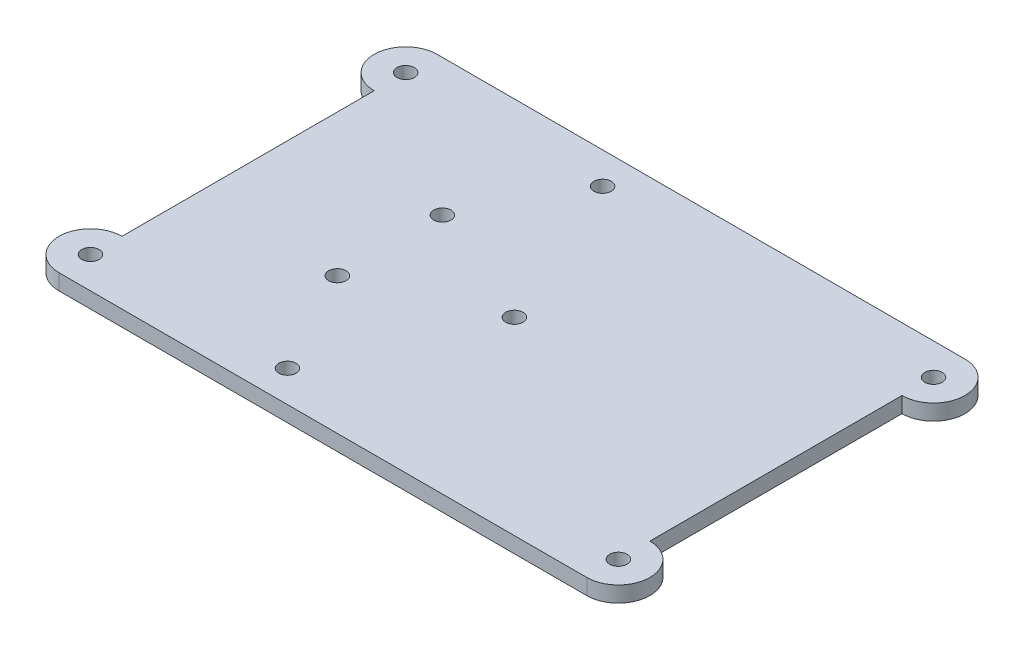
ISO-10303-21;
HEADER;
FILE_DESCRIPTION(('STEP AP214'),'2;1');
FILE_NAME('part.step','',(''),(''),'','','');
FILE_SCHEMA(('AUTOMOTIVE_DESIGN { 1 0 10303 214 1 1 1 1 }'));
ENDSEC;
DATA;
#1=APPLICATION_CONTEXT('core data for automotive mechanical design processes');
#2=APPLICATION_PROTOCOL_DEFINITION('international standard','automotive_design',2000,#1);
#3=PRODUCT_CONTEXT('',#1,'mechanical');
#4=PRODUCT('Part','Part','',(#3));
#5=PRODUCT_RELATED_PRODUCT_CATEGORY('part','',(#4));
#6=PRODUCT_DEFINITION_FORMATION('','',#4);
#7=PRODUCT_DEFINITION_CONTEXT('part definition',#1,'design');
#8=PRODUCT_DEFINITION('design','',#6,#7);
#9=PRODUCT_DEFINITION_SHAPE('','',#8);
#10=(LENGTH_UNIT() NAMED_UNIT(*) SI_UNIT(.MILLI.,.METRE.));
#11=(NAMED_UNIT(*) PLANE_ANGLE_UNIT() SI_UNIT($,.RADIAN.));
#12=(NAMED_UNIT(*) SI_UNIT($,.STERADIAN.) SOLID_ANGLE_UNIT());
#13=UNCERTAINTY_MEASURE_WITH_UNIT(LENGTH_MEASURE(1.E-05),#10,'distance_accuracy_value','');
#14=(GEOMETRIC_REPRESENTATION_CONTEXT(3) GLOBAL_UNCERTAINTY_ASSIGNED_CONTEXT((#13)) GLOBAL_UNIT_ASSIGNED_CONTEXT((#10,
#11,#12)) REPRESENTATION_CONTEXT('',''));
#15=CARTESIAN_POINT('',(0.,0.,0.));
#16=DIRECTION('',(0.,0.,1.));
#17=DIRECTION('',(1.,0.,0.));
#18=AXIS2_PLACEMENT_3D('',#15,#16,#17);
#19=CARTESIAN_POINT('',(71.8743010318787,3.,-47.9274226090967));
#20=DIRECTION('',(0.,1.,0.));
#21=DIRECTION('',(0.,0.,1.));
#22=AXIS2_PLACEMENT_3D('',#19,#20,#21);
#23=PLANE('',#22);
#24=CARTESIAN_POINT('',(-1.62569896812129,3.,-7.92742260909669));
#25=DIRECTION('',(0.,1.,0.));
#26=DIRECTION('',(0.,0.,1.));
#27=AXIS2_PLACEMENT_3D('',#24,#25,#26);
#28=CIRCLE('',#27,1.65);
#29=CARTESIAN_POINT('',(-1.62569896812129,3.,-6.27742260909669));
#30=VERTEX_POINT('',#29);
#31=EDGE_CURVE('E218',#30,#30,#28,.T.);
#32=ORIENTED_EDGE('',*,*,#31,.F.);
#33=EDGE_LOOP('',(#32));
#34=FACE_BOUND('',#33,.T.);
#35=CARTESIAN_POINT('',(71.8743010318787,3.,12.0725773909033));
#36=DIRECTION('',(0.,1.,0.));
#37=DIRECTION('',(0.,0.,1.));
#38=AXIS2_PLACEMENT_3D('',#35,#36,#37);
#39=CIRCLE('',#38,1.65);
#40=CARTESIAN_POINT('',(71.8743010318787,3.,13.7225773909033));
#41=VERTEX_POINT('',#40);
#42=EDGE_CURVE('E206',#41,#41,#39,.T.);
#43=ORIENTED_EDGE('',*,*,#42,.F.);
#44=EDGE_LOOP('',(#43));
#45=FACE_BOUND('',#44,.T.);
#46=CARTESIAN_POINT('',(-28.6256989681213,3.,12.0725773909033));
#47=DIRECTION('',(0.,1.,0.));
#48=DIRECTION('',(0.,0.,1.));
#49=AXIS2_PLACEMENT_3D('',#46,#47,#48);
#50=CIRCLE('',#49,1.65);
#51=CARTESIAN_POINT('',(-28.6256989681213,3.,13.7225773909033));
#52=VERTEX_POINT('',#51);
#53=EDGE_CURVE('E194',#52,#52,#50,.T.);
#54=ORIENTED_EDGE('',*,*,#53,.F.);
#55=EDGE_LOOP('',(#54));
#56=FACE_BOUND('',#55,.T.);
#57=CARTESIAN_POINT('',(8.87430103187871,3.,-47.9274226090967));
#58=DIRECTION('',(0.,1.,0.));
#59=DIRECTION('',(0.,0.,1.));
#60=AXIS2_PLACEMENT_3D('',#57,#58,#59);
#61=CIRCLE('',#60,1.65);
#62=CARTESIAN_POINT('',(8.87430103187871,3.,-46.2774226090967));
#63=VERTEX_POINT('',#62);
#64=EDGE_CURVE('E182',#63,#63,#61,.T.);
#65=ORIENTED_EDGE('',*,*,#64,.F.);
#66=EDGE_LOOP('',(#65));
#67=FACE_BOUND('',#66,.T.);
#68=CARTESIAN_POINT('',(71.8743010318787,3.,-47.9274226090967));
#69=DIRECTION('',(0.,1.,0.));
#70=DIRECTION('',(0.,0.,1.));
#71=AXIS2_PLACEMENT_3D('',#68,#69,#70);
#72=CIRCLE('',#71,6.00000000000001);
#73=CARTESIAN_POINT('',(71.8743010318787,3.,-41.9274226090967));
#74=VERTEX_POINT('',#73);
#75=CARTESIAN_POINT('',(71.8743010318787,3.,-53.9274226090967));
#76=VERTEX_POINT('',#75);
#77=EDGE_CURVE('E145',#74,#76,#72,.T.);
#78=ORIENTED_EDGE('',*,*,#77,.T.);
#79=DIRECTION('',(-1.,0.,0.));
#80=VECTOR('',#79,1.);
#81=CARTESIAN_POINT('',(-28.6256989681213,3.,-53.9274226090967));
#82=LINE('',#81,#80);
#83=CARTESIAN_POINT('',(-28.6256989681213,3.,-53.9274226090967));
#84=VERTEX_POINT('',#83);
#85=EDGE_CURVE('E93',#76,#84,#82,.T.);
#86=ORIENTED_EDGE('',*,*,#85,.T.);
#87=CARTESIAN_POINT('',(-28.6256989681213,3.,-47.9274226090967));
#88=DIRECTION('',(0.,1.,0.));
#89=DIRECTION('',(0.,0.,1.));
#90=AXIS2_PLACEMENT_3D('',#87,#88,#89);
#91=CIRCLE('',#90,6.00000000000001);
#92=CARTESIAN_POINT('',(-28.6256989681213,3.,-41.9274226090967));
#93=VERTEX_POINT('',#92);
#94=EDGE_CURVE('E160',#84,#93,#91,.T.);
#95=ORIENTED_EDGE('',*,*,#94,.T.);
#96=DIRECTION('',(0.,0.,1.));
#97=VECTOR('',#96,1.);
#98=CARTESIAN_POINT('',(-28.6256989681213,3.,-41.9274226090967));
#99=LINE('',#98,#97);
#100=CARTESIAN_POINT('',(-28.6256989681213,3.,6.07257739090331));
#101=VERTEX_POINT('',#100);
#102=EDGE_CURVE('E173',#93,#101,#99,.T.);
#103=ORIENTED_EDGE('',*,*,#102,.T.);
#104=CARTESIAN_POINT('',(-28.6256989681213,3.,12.0725773909033));
#105=DIRECTION('',(0.,1.,0.));
#106=DIRECTION('',(0.,0.,1.));
#107=AXIS2_PLACEMENT_3D('',#104,#105,#106);
#108=CIRCLE('',#107,6.);
#109=CARTESIAN_POINT('',(-28.6256989681213,3.,18.0725773909033));
#110=VERTEX_POINT('',#109);
#111=EDGE_CURVE('E112',#101,#110,#108,.T.);
#112=ORIENTED_EDGE('',*,*,#111,.T.);
#113=DIRECTION('',(1.,0.,0.));
#114=VECTOR('',#113,1.);
#115=CARTESIAN_POINT('',(-28.6256989681213,3.,18.0725773909033));
#116=LINE('',#115,#114);
#117=CARTESIAN_POINT('',(71.8743010318787,3.,18.0725773909033));
#118=VERTEX_POINT('',#117);
#119=EDGE_CURVE('E106',#110,#118,#116,.T.);
#120=ORIENTED_EDGE('',*,*,#119,.T.);
#121=CARTESIAN_POINT('',(71.8743010318787,3.,12.0725773909033));
#122=DIRECTION('',(0.,1.,0.));
#123=DIRECTION('',(0.,0.,1.));
#124=AXIS2_PLACEMENT_3D('',#121,#122,#123);
#125=CIRCLE('',#124,6.);
#126=CARTESIAN_POINT('',(71.8743010318787,3.,6.07257739090331));
#127=VERTEX_POINT('',#126);
#128=EDGE_CURVE('E110',#118,#127,#125,.T.);
#129=ORIENTED_EDGE('',*,*,#128,.T.);
#130=DIRECTION('',(0.,0.,-1.));
#131=VECTOR('',#130,1.);
#132=CARTESIAN_POINT('',(71.8743010318787,3.,-41.9274226090967));
#133=LINE('',#132,#131);
#134=EDGE_CURVE('E50',#127,#74,#133,.T.);
#135=ORIENTED_EDGE('',*,*,#134,.T.);
#136=EDGE_LOOP('',(#78,#86,#95,#103,#112,#120,#129,#135));
#137=FACE_BOUND('',#136,.T.);
#138=CARTESIAN_POINT('',(-28.6256989681213,3.,-47.9274226090967));
#139=DIRECTION('',(0.,1.,0.));
#140=DIRECTION('',(0.,0.,1.));
#141=AXIS2_PLACEMENT_3D('',#138,#139,#140);
#142=CIRCLE('',#141,1.65);
#143=CARTESIAN_POINT('',(-28.6256989681213,3.,-46.2774226090967));
#144=VERTEX_POINT('',#143);
#145=EDGE_CURVE('E134',#144,#144,#142,.T.);
#146=ORIENTED_EDGE('',*,*,#145,.F.);
#147=EDGE_LOOP('',(#146));
#148=FACE_BOUND('',#147,.T.);
#149=CARTESIAN_POINT('',(71.8743010318787,3.,-47.9274226090967));
#150=DIRECTION('',(0.,1.,0.));
#151=DIRECTION('',(0.,0.,1.));
#152=AXIS2_PLACEMENT_3D('',#149,#150,#151);
#153=CIRCLE('',#152,1.65);
#154=CARTESIAN_POINT('',(71.8743010318787,3.,-46.2774226090967));
#155=VERTEX_POINT('',#154);
#156=EDGE_CURVE('E188',#155,#155,#153,.T.);
#157=ORIENTED_EDGE('',*,*,#156,.F.);
#158=EDGE_LOOP('',(#157));
#159=FACE_BOUND('',#158,.T.);
#160=CARTESIAN_POINT('',(8.87430103187872,3.,12.0725773909033));
#161=DIRECTION('',(0.,1.,0.));
#162=DIRECTION('',(0.,0.,1.));
#163=AXIS2_PLACEMENT_3D('',#160,#161,#162);
#164=CIRCLE('',#163,1.65);
#165=CARTESIAN_POINT('',(8.87430103187872,3.,13.7225773909033));
#166=VERTEX_POINT('',#165);
#167=EDGE_CURVE('E200',#166,#166,#164,.T.);
#168=ORIENTED_EDGE('',*,*,#167,.F.);
#169=EDGE_LOOP('',(#168));
#170=FACE_BOUND('',#169,.T.);
#171=CARTESIAN_POINT('',(-1.62569896812129,3.,-27.9274226090967));
#172=DIRECTION('',(0.,1.,0.));
#173=DIRECTION('',(0.,0.,1.));
#174=AXIS2_PLACEMENT_3D('',#171,#172,#173);
#175=CIRCLE('',#174,1.65);
#176=CARTESIAN_POINT('',(-1.62569896812129,3.,-26.2774226090967));
#177=VERTEX_POINT('',#176);
#178=EDGE_CURVE('E212',#177,#177,#175,.T.);
#179=ORIENTED_EDGE('',*,*,#178,.F.);
#180=EDGE_LOOP('',(#179));
#181=FACE_BOUND('',#180,.T.);
#182=CARTESIAN_POINT('',(22.0743010318787,3.,-17.9274226090967));
#183=DIRECTION('',(0.,1.,0.));
#184=DIRECTION('',(0.,0.,1.));
#185=AXIS2_PLACEMENT_3D('',#182,#183,#184);
#186=CIRCLE('',#185,1.65);
#187=CARTESIAN_POINT('',(22.0743010318787,3.,-16.2774226090967));
#188=VERTEX_POINT('',#187);
#189=EDGE_CURVE('E224',#188,#188,#186,.T.);
#190=ORIENTED_EDGE('',*,*,#189,.F.);
#191=EDGE_LOOP('',(#190));
#192=FACE_BOUND('',#191,.T.);
#193=ADVANCED_FACE('F33',(#34,#45,#56,#67,#137,#148,#159,#170,#181,#192),#23,.T.);
#194=CARTESIAN_POINT('',(71.8743010318787,0.,-47.9274226090967));
#195=DIRECTION('',(0.,1.,0.));
#196=DIRECTION('',(0.,0.,1.));
#197=AXIS2_PLACEMENT_3D('',#194,#195,#196);
#198=PLANE('',#197);
#199=CARTESIAN_POINT('',(-1.62569896812129,0.,-7.92742260909669));
#200=DIRECTION('',(0.,1.,0.));
#201=DIRECTION('',(0.,0.,1.));
#202=AXIS2_PLACEMENT_3D('',#199,#200,#201);
#203=CIRCLE('',#202,1.65);
#204=CARTESIAN_POINT('',(-1.62569896812129,0.,-6.27742260909669));
#205=VERTEX_POINT('',#204);
#206=EDGE_CURVE('E221',#205,#205,#203,.T.);
#207=ORIENTED_EDGE('',*,*,#206,.T.);
#208=EDGE_LOOP('',(#207));
#209=FACE_BOUND('',#208,.T.);
#210=CARTESIAN_POINT('',(71.8743010318787,0.,12.0725773909033));
#211=DIRECTION('',(0.,1.,0.));
#212=DIRECTION('',(0.,0.,1.));
#213=AXIS2_PLACEMENT_3D('',#210,#211,#212);
#214=CIRCLE('',#213,1.65);
#215=CARTESIAN_POINT('',(71.8743010318787,0.,13.7225773909033));
#216=VERTEX_POINT('',#215);
#217=EDGE_CURVE('E209',#216,#216,#214,.T.);
#218=ORIENTED_EDGE('',*,*,#217,.T.);
#219=EDGE_LOOP('',(#218));
#220=FACE_BOUND('',#219,.T.);
#221=CARTESIAN_POINT('',(-28.6256989681213,0.,12.0725773909033));
#222=DIRECTION('',(0.,1.,0.));
#223=DIRECTION('',(0.,0.,1.));
#224=AXIS2_PLACEMENT_3D('',#221,#222,#223);
#225=CIRCLE('',#224,1.65);
#226=CARTESIAN_POINT('',(-28.6256989681213,0.,13.7225773909033));
#227=VERTEX_POINT('',#226);
#228=EDGE_CURVE('E197',#227,#227,#225,.T.);
#229=ORIENTED_EDGE('',*,*,#228,.T.);
#230=EDGE_LOOP('',(#229));
#231=FACE_BOUND('',#230,.T.);
#232=CARTESIAN_POINT('',(8.87430103187871,0.,-47.9274226090967));
#233=DIRECTION('',(0.,1.,0.));
#234=DIRECTION('',(0.,0.,1.));
#235=AXIS2_PLACEMENT_3D('',#232,#233,#234);
#236=CIRCLE('',#235,1.65);
#237=CARTESIAN_POINT('',(8.87430103187871,0.,-46.2774226090967));
#238=VERTEX_POINT('',#237);
#239=EDGE_CURVE('E185',#238,#238,#236,.T.);
#240=ORIENTED_EDGE('',*,*,#239,.T.);
#241=EDGE_LOOP('',(#240));
#242=FACE_BOUND('',#241,.T.);
#243=CARTESIAN_POINT('',(71.8743010318787,0.,-47.9274226090967));
#244=DIRECTION('',(0.,1.,0.));
#245=DIRECTION('',(0.,0.,1.));
#246=AXIS2_PLACEMENT_3D('',#243,#244,#245);
#247=CIRCLE('',#246,6.00000000000001);
#248=CARTESIAN_POINT('',(71.8743010318787,0.,-41.9274226090967));
#249=VERTEX_POINT('',#248);
#250=CARTESIAN_POINT('',(71.8743010318787,0.,-53.9274226090967));
#251=VERTEX_POINT('',#250);
#252=EDGE_CURVE('E130',#249,#251,#247,.T.);
#253=ORIENTED_EDGE('',*,*,#252,.F.);
#254=DIRECTION('',(0.,0.,-1.));
#255=VECTOR('',#254,1.);
#256=CARTESIAN_POINT('',(71.8743010318787,0.,-41.9274226090967));
#257=LINE('',#256,#255);
#258=CARTESIAN_POINT('',(71.8743010318787,0.,6.07257739090331));
#259=VERTEX_POINT('',#258);
#260=EDGE_CURVE('E85',#259,#249,#257,.T.);
#261=ORIENTED_EDGE('',*,*,#260,.F.);
#262=CARTESIAN_POINT('',(71.8743010318787,0.,12.0725773909033));
#263=DIRECTION('',(0.,1.,0.));
#264=DIRECTION('',(0.,0.,1.));
#265=AXIS2_PLACEMENT_3D('',#262,#263,#264);
#266=CIRCLE('',#265,6.);
#267=CARTESIAN_POINT('',(71.8743010318787,0.,18.0725773909033));
#268=VERTEX_POINT('',#267);
#269=EDGE_CURVE('E79',#268,#259,#266,.T.);
#270=ORIENTED_EDGE('',*,*,#269,.F.);
#271=DIRECTION('',(1.,0.,0.));
#272=VECTOR('',#271,1.);
#273=CARTESIAN_POINT('',(-28.6256989681213,0.,18.0725773909033));
#274=LINE('',#273,#272);
#275=CARTESIAN_POINT('',(-28.6256989681213,0.,18.0725773909033));
#276=VERTEX_POINT('',#275);
#277=EDGE_CURVE('E120',#276,#268,#274,.T.);
#278=ORIENTED_EDGE('',*,*,#277,.F.);
#279=CARTESIAN_POINT('',(-28.6256989681213,0.,12.0725773909033));
#280=DIRECTION('',(0.,1.,0.));
#281=DIRECTION('',(0.,0.,1.));
#282=AXIS2_PLACEMENT_3D('',#279,#280,#281);
#283=CIRCLE('',#282,6.);
#284=CARTESIAN_POINT('',(-28.6256989681213,0.,6.07257739090331));
#285=VERTEX_POINT('',#284);
#286=EDGE_CURVE('E140',#285,#276,#283,.T.);
#287=ORIENTED_EDGE('',*,*,#286,.F.);
#288=DIRECTION('',(0.,0.,1.));
#289=VECTOR('',#288,1.);
#290=CARTESIAN_POINT('',(-28.6256989681213,0.,-41.9274226090967));
#291=LINE('',#290,#289);
#292=CARTESIAN_POINT('',(-28.6256989681213,0.,-41.9274226090967));
#293=VERTEX_POINT('',#292);
#294=EDGE_CURVE('E138',#293,#285,#291,.T.);
#295=ORIENTED_EDGE('',*,*,#294,.F.);
#296=CARTESIAN_POINT('',(-28.6256989681213,0.,-47.9274226090967));
#297=DIRECTION('',(0.,1.,0.));
#298=DIRECTION('',(0.,0.,1.));
#299=AXIS2_PLACEMENT_3D('',#296,#297,#298);
#300=CIRCLE('',#299,6.00000000000001);
#301=CARTESIAN_POINT('',(-28.6256989681213,0.,-53.9274226090967));
#302=VERTEX_POINT('',#301);
#303=EDGE_CURVE('E136',#302,#293,#300,.T.);
#304=ORIENTED_EDGE('',*,*,#303,.F.);
#305=DIRECTION('',(-1.,0.,0.));
#306=VECTOR('',#305,1.);
#307=CARTESIAN_POINT('',(-28.6256989681213,0.,-53.9274226090967));
#308=LINE('',#307,#306);
#309=EDGE_CURVE('E133',#251,#302,#308,.T.);
#310=ORIENTED_EDGE('',*,*,#309,.F.);
#311=EDGE_LOOP('',(#253,#261,#270,#278,#287,#295,#304,#310));
#312=FACE_BOUND('',#311,.T.);
#313=CARTESIAN_POINT('',(-28.6256989681213,0.,-47.9274226090967));
#314=DIRECTION('',(0.,1.,0.));
#315=DIRECTION('',(0.,0.,1.));
#316=AXIS2_PLACEMENT_3D('',#313,#314,#315);
#317=CIRCLE('',#316,1.65);
#318=CARTESIAN_POINT('',(-28.6256989681213,0.,-46.2774226090967));
#319=VERTEX_POINT('',#318);
#320=EDGE_CURVE('E179',#319,#319,#317,.T.);
#321=ORIENTED_EDGE('',*,*,#320,.T.);
#322=EDGE_LOOP('',(#321));
#323=FACE_BOUND('',#322,.T.);
#324=CARTESIAN_POINT('',(71.8743010318787,0.,-47.9274226090967));
#325=DIRECTION('',(0.,1.,0.));
#326=DIRECTION('',(0.,0.,1.));
#327=AXIS2_PLACEMENT_3D('',#324,#325,#326);
#328=CIRCLE('',#327,1.65);
#329=CARTESIAN_POINT('',(71.8743010318787,0.,-46.2774226090967));
#330=VERTEX_POINT('',#329);
#331=EDGE_CURVE('E191',#330,#330,#328,.T.);
#332=ORIENTED_EDGE('',*,*,#331,.T.);
#333=EDGE_LOOP('',(#332));
#334=FACE_BOUND('',#333,.T.);
#335=CARTESIAN_POINT('',(8.87430103187872,0.,12.0725773909033));
#336=DIRECTION('',(0.,1.,0.));
#337=DIRECTION('',(0.,0.,1.));
#338=AXIS2_PLACEMENT_3D('',#335,#336,#337);
#339=CIRCLE('',#338,1.65);
#340=CARTESIAN_POINT('',(8.87430103187872,0.,13.7225773909033));
#341=VERTEX_POINT('',#340);
#342=EDGE_CURVE('E203',#341,#341,#339,.T.);
#343=ORIENTED_EDGE('',*,*,#342,.T.);
#344=EDGE_LOOP('',(#343));
#345=FACE_BOUND('',#344,.T.);
#346=CARTESIAN_POINT('',(-1.62569896812129,0.,-27.9274226090967));
#347=DIRECTION('',(0.,1.,0.));
#348=DIRECTION('',(0.,0.,1.));
#349=AXIS2_PLACEMENT_3D('',#346,#347,#348);
#350=CIRCLE('',#349,1.65);
#351=CARTESIAN_POINT('',(-1.62569896812129,0.,-26.2774226090967));
#352=VERTEX_POINT('',#351);
#353=EDGE_CURVE('E215',#352,#352,#350,.T.);
#354=ORIENTED_EDGE('',*,*,#353,.T.);
#355=EDGE_LOOP('',(#354));
#356=FACE_BOUND('',#355,.T.);
#357=CARTESIAN_POINT('',(22.0743010318787,0.,-17.9274226090967));
#358=DIRECTION('',(0.,1.,0.));
#359=DIRECTION('',(0.,0.,1.));
#360=AXIS2_PLACEMENT_3D('',#357,#358,#359);
#361=CIRCLE('',#360,1.65);
#362=CARTESIAN_POINT('',(22.0743010318787,0.,-16.2774226090967));
#363=VERTEX_POINT('',#362);
#364=EDGE_CURVE('E227',#363,#363,#361,.T.);
#365=ORIENTED_EDGE('',*,*,#364,.T.);
#366=EDGE_LOOP('',(#365));
#367=FACE_BOUND('',#366,.T.);
#368=ADVANCED_FACE('F164',(#209,#220,#231,#242,#312,#323,#334,#345,#356,#367),#198,.F.);
#369=CARTESIAN_POINT('',(71.8743010318787,3.,-47.9274226090967));
#370=DIRECTION('',(0.,-1.,0.));
#371=DIRECTION('',(0.,0.,-1.));
#372=AXIS2_PLACEMENT_3D('',#369,#370,#371);
#373=CYLINDRICAL_SURFACE('',#372,6.00000000000001);
#374=ORIENTED_EDGE('',*,*,#252,.T.);
#375=DIRECTION('',(0.,-1.,0.));
#376=VECTOR('',#375,1.);
#377=CARTESIAN_POINT('',(71.8743010318787,3.,-53.9274226090967));
#378=LINE('',#377,#376);
#379=EDGE_CURVE('E11',#76,#251,#378,.T.);
#380=ORIENTED_EDGE('',*,*,#379,.F.);
#381=ORIENTED_EDGE('',*,*,#77,.F.);
#382=DIRECTION('',(0.,-1.,0.));
#383=VECTOR('',#382,1.);
#384=CARTESIAN_POINT('',(71.8743010318787,3.,-41.9274226090967));
#385=LINE('',#384,#383);
#386=EDGE_CURVE('E126',#74,#249,#385,.T.);
#387=ORIENTED_EDGE('',*,*,#386,.T.);
#388=EDGE_LOOP('',(#374,#380,#381,#387));
#389=FACE_BOUND('',#388,.T.);
#390=ADVANCED_FACE('F35',(#389),#373,.T.);
#391=CARTESIAN_POINT('',(-28.6256989681213,3.,-53.9274226090967));
#392=DIRECTION('',(0.,0.,1.));
#393=DIRECTION('',(1.,0.,0.));
#394=AXIS2_PLACEMENT_3D('',#391,#392,#393);
#395=PLANE('',#394);
#396=ORIENTED_EDGE('',*,*,#309,.T.);
#397=DIRECTION('',(0.,-1.,0.));
#398=VECTOR('',#397,1.);
#399=CARTESIAN_POINT('',(-28.6256989681213,3.,-53.9274226090967));
#400=LINE('',#399,#398);
#401=EDGE_CURVE('E42',#84,#302,#400,.T.);
#402=ORIENTED_EDGE('',*,*,#401,.F.);
#403=ORIENTED_EDGE('',*,*,#85,.F.);
#404=ORIENTED_EDGE('',*,*,#379,.T.);
#405=EDGE_LOOP('',(#396,#402,#403,#404));
#406=FACE_BOUND('',#405,.T.);
#407=ADVANCED_FACE('F262',(#406),#395,.F.);
#408=CARTESIAN_POINT('',(-28.6256989681213,3.,-47.9274226090967));
#409=DIRECTION('',(0.,-1.,0.));
#410=DIRECTION('',(0.,0.,-1.));
#411=AXIS2_PLACEMENT_3D('',#408,#409,#410);
#412=CYLINDRICAL_SURFACE('',#411,6.00000000000001);
#413=ORIENTED_EDGE('',*,*,#303,.T.);
#414=DIRECTION('',(0.,-1.,0.));
#415=VECTOR('',#414,1.);
#416=CARTESIAN_POINT('',(-28.6256989681213,3.,-41.9274226090967));
#417=LINE('',#416,#415);
#418=EDGE_CURVE('E152',#93,#293,#417,.T.);
#419=ORIENTED_EDGE('',*,*,#418,.F.);
#420=ORIENTED_EDGE('',*,*,#94,.F.);
#421=ORIENTED_EDGE('',*,*,#401,.T.);
#422=EDGE_LOOP('',(#413,#419,#420,#421));
#423=FACE_BOUND('',#422,.T.);
#424=ADVANCED_FACE('F158',(#423),#412,.T.);
#425=CARTESIAN_POINT('',(-28.6256989681213,3.,-41.9274226090967));
#426=DIRECTION('',(1.,0.,0.));
#427=DIRECTION('',(0.,0.,-1.));
#428=AXIS2_PLACEMENT_3D('',#425,#426,#427);
#429=PLANE('',#428);
#430=ORIENTED_EDGE('',*,*,#294,.T.);
#431=DIRECTION('',(0.,-1.,0.));
#432=VECTOR('',#431,1.);
#433=CARTESIAN_POINT('',(-28.6256989681213,3.,6.07257739090331));
#434=LINE('',#433,#432);
#435=EDGE_CURVE('E149',#101,#285,#434,.T.);
#436=ORIENTED_EDGE('',*,*,#435,.F.);
#437=ORIENTED_EDGE('',*,*,#102,.F.);
#438=ORIENTED_EDGE('',*,*,#418,.T.);
#439=EDGE_LOOP('',(#430,#436,#437,#438));
#440=FACE_BOUND('',#439,.T.);
#441=ADVANCED_FACE('F169',(#440),#429,.F.);
#442=CARTESIAN_POINT('',(-28.6256989681213,3.,12.0725773909033));
#443=DIRECTION('',(0.,-1.,0.));
#444=DIRECTION('',(0.,0.,-1.));
#445=AXIS2_PLACEMENT_3D('',#442,#443,#444);
#446=CYLINDRICAL_SURFACE('',#445,6.);
#447=ORIENTED_EDGE('',*,*,#286,.T.);
#448=DIRECTION('',(0.,-1.,0.));
#449=VECTOR('',#448,1.);
#450=CARTESIAN_POINT('',(-28.6256989681213,3.,18.0725773909033));
#451=LINE('',#450,#449);
#452=EDGE_CURVE('E121',#110,#276,#451,.T.);
#453=ORIENTED_EDGE('',*,*,#452,.F.);
#454=ORIENTED_EDGE('',*,*,#111,.F.);
#455=ORIENTED_EDGE('',*,*,#435,.T.);
#456=EDGE_LOOP('',(#447,#453,#454,#455));
#457=FACE_BOUND('',#456,.T.);
#458=ADVANCED_FACE('F172',(#457),#446,.T.);
#459=CARTESIAN_POINT('',(-28.6256989681213,3.,18.0725773909033));
#460=DIRECTION('',(0.,0.,-1.));
#461=DIRECTION('',(-1.,0.,0.));
#462=AXIS2_PLACEMENT_3D('',#459,#460,#461);
#463=PLANE('',#462);
#464=ORIENTED_EDGE('',*,*,#277,.T.);
#465=DIRECTION('',(0.,-1.,0.));
#466=VECTOR('',#465,1.);
#467=CARTESIAN_POINT('',(71.8743010318787,3.,18.0725773909033));
#468=LINE('',#467,#466);
#469=EDGE_CURVE('E117',#118,#268,#468,.T.);
#470=ORIENTED_EDGE('',*,*,#469,.F.);
#471=ORIENTED_EDGE('',*,*,#119,.F.);
#472=ORIENTED_EDGE('',*,*,#452,.T.);
#473=EDGE_LOOP('',(#464,#470,#471,#472));
#474=FACE_BOUND('',#473,.T.);
#475=ADVANCED_FACE('F118',(#474),#463,.F.);
#476=CARTESIAN_POINT('',(71.8743010318787,3.,12.0725773909033));
#477=DIRECTION('',(0.,-1.,0.));
#478=DIRECTION('',(0.,0.,-1.));
#479=AXIS2_PLACEMENT_3D('',#476,#477,#478);
#480=CYLINDRICAL_SURFACE('',#479,6.);
#481=ORIENTED_EDGE('',*,*,#269,.T.);
#482=DIRECTION('',(0.,-1.,0.));
#483=VECTOR('',#482,1.);
#484=CARTESIAN_POINT('',(71.8743010318787,3.,6.07257739090331));
#485=LINE('',#484,#483);
#486=EDGE_CURVE('E122',#127,#259,#485,.T.);
#487=ORIENTED_EDGE('',*,*,#486,.F.);
#488=ORIENTED_EDGE('',*,*,#128,.F.);
#489=ORIENTED_EDGE('',*,*,#469,.T.);
#490=EDGE_LOOP('',(#481,#487,#488,#489));
#491=FACE_BOUND('',#490,.T.);
#492=ADVANCED_FACE('F124',(#491),#480,.T.);
#493=CARTESIAN_POINT('',(71.8743010318787,3.,-41.9274226090967));
#494=DIRECTION('',(-1.,0.,0.));
#495=DIRECTION('',(0.,0.,1.));
#496=AXIS2_PLACEMENT_3D('',#493,#494,#495);
#497=PLANE('',#496);
#498=ORIENTED_EDGE('',*,*,#260,.T.);
#499=ORIENTED_EDGE('',*,*,#386,.F.);
#500=ORIENTED_EDGE('',*,*,#134,.F.);
#501=ORIENTED_EDGE('',*,*,#486,.T.);
#502=EDGE_LOOP('',(#498,#499,#500,#501));
#503=FACE_BOUND('',#502,.T.);
#504=ADVANCED_FACE('F250',(#503),#497,.F.);
#505=CARTESIAN_POINT('',(-28.6256989681213,3.,-47.9274226090967));
#506=DIRECTION('',(0.,-1.,0.));
#507=DIRECTION('',(0.,0.,-1.));
#508=AXIS2_PLACEMENT_3D('',#505,#506,#507);
#509=CYLINDRICAL_SURFACE('',#508,1.65);
#510=ORIENTED_EDGE('',*,*,#145,.T.);
#511=EDGE_LOOP('',(#510));
#512=FACE_BOUND('',#511,.T.);
#513=ORIENTED_EDGE('',*,*,#320,.F.);
#514=EDGE_LOOP('',(#513));
#515=FACE_BOUND('',#514,.T.);
#516=ADVANCED_FACE('F247',(#512,#515),#509,.F.);
#517=CARTESIAN_POINT('',(8.87430103187871,3.,-47.9274226090967));
#518=DIRECTION('',(0.,-1.,0.));
#519=DIRECTION('',(0.,0.,-1.));
#520=AXIS2_PLACEMENT_3D('',#517,#518,#519);
#521=CYLINDRICAL_SURFACE('',#520,1.65);
#522=ORIENTED_EDGE('',*,*,#64,.T.);
#523=EDGE_LOOP('',(#522));
#524=FACE_BOUND('',#523,.T.);
#525=ORIENTED_EDGE('',*,*,#239,.F.);
#526=EDGE_LOOP('',(#525));
#527=FACE_BOUND('',#526,.T.);
#528=ADVANCED_FACE('F326',(#524,#527),#521,.F.);
#529=CARTESIAN_POINT('',(71.8743010318787,3.,-47.9274226090967));
#530=DIRECTION('',(0.,-1.,0.));
#531=DIRECTION('',(0.,0.,-1.));
#532=AXIS2_PLACEMENT_3D('',#529,#530,#531);
#533=CYLINDRICAL_SURFACE('',#532,1.65);
#534=ORIENTED_EDGE('',*,*,#156,.T.);
#535=EDGE_LOOP('',(#534));
#536=FACE_BOUND('',#535,.T.);
#537=ORIENTED_EDGE('',*,*,#331,.F.);
#538=EDGE_LOOP('',(#537));
#539=FACE_BOUND('',#538,.T.);
#540=ADVANCED_FACE('F334',(#536,#539),#533,.F.);
#541=CARTESIAN_POINT('',(-28.6256989681213,3.,12.0725773909033));
#542=DIRECTION('',(0.,-1.,0.));
#543=DIRECTION('',(0.,0.,-1.));
#544=AXIS2_PLACEMENT_3D('',#541,#542,#543);
#545=CYLINDRICAL_SURFACE('',#544,1.65);
#546=ORIENTED_EDGE('',*,*,#53,.T.);
#547=EDGE_LOOP('',(#546));
#548=FACE_BOUND('',#547,.T.);
#549=ORIENTED_EDGE('',*,*,#228,.F.);
#550=EDGE_LOOP('',(#549));
#551=FACE_BOUND('',#550,.T.);
#552=ADVANCED_FACE('F342',(#548,#551),#545,.F.);
#553=CARTESIAN_POINT('',(8.87430103187872,3.,12.0725773909033));
#554=DIRECTION('',(0.,-1.,0.));
#555=DIRECTION('',(0.,0.,-1.));
#556=AXIS2_PLACEMENT_3D('',#553,#554,#555);
#557=CYLINDRICAL_SURFACE('',#556,1.65);
#558=ORIENTED_EDGE('',*,*,#167,.T.);
#559=EDGE_LOOP('',(#558));
#560=FACE_BOUND('',#559,.T.);
#561=ORIENTED_EDGE('',*,*,#342,.F.);
#562=EDGE_LOOP('',(#561));
#563=FACE_BOUND('',#562,.T.);
#564=ADVANCED_FACE('F351',(#560,#563),#557,.F.);
#565=CARTESIAN_POINT('',(71.8743010318787,3.,12.0725773909033));
#566=DIRECTION('',(0.,-1.,0.));
#567=DIRECTION('',(0.,0.,-1.));
#568=AXIS2_PLACEMENT_3D('',#565,#566,#567);
#569=CYLINDRICAL_SURFACE('',#568,1.65);
#570=ORIENTED_EDGE('',*,*,#42,.T.);
#571=EDGE_LOOP('',(#570));
#572=FACE_BOUND('',#571,.T.);
#573=ORIENTED_EDGE('',*,*,#217,.F.);
#574=EDGE_LOOP('',(#573));
#575=FACE_BOUND('',#574,.T.);
#576=ADVANCED_FACE('F360',(#572,#575),#569,.F.);
#577=CARTESIAN_POINT('',(-1.62569896812129,3.,-27.9274226090967));
#578=DIRECTION('',(0.,-1.,0.));
#579=DIRECTION('',(0.,0.,-1.));
#580=AXIS2_PLACEMENT_3D('',#577,#578,#579);
#581=CYLINDRICAL_SURFACE('',#580,1.65);
#582=ORIENTED_EDGE('',*,*,#178,.T.);
#583=EDGE_LOOP('',(#582));
#584=FACE_BOUND('',#583,.T.);
#585=ORIENTED_EDGE('',*,*,#353,.F.);
#586=EDGE_LOOP('',(#585));
#587=FACE_BOUND('',#586,.T.);
#588=ADVANCED_FACE('F369',(#584,#587),#581,.F.);
#589=CARTESIAN_POINT('',(-1.62569896812129,3.,-7.92742260909669));
#590=DIRECTION('',(0.,-1.,0.));
#591=DIRECTION('',(0.,0.,-1.));
#592=AXIS2_PLACEMENT_3D('',#589,#590,#591);
#593=CYLINDRICAL_SURFACE('',#592,1.65);
#594=ORIENTED_EDGE('',*,*,#31,.T.);
#595=EDGE_LOOP('',(#594));
#596=FACE_BOUND('',#595,.T.);
#597=ORIENTED_EDGE('',*,*,#206,.F.);
#598=EDGE_LOOP('',(#597));
#599=FACE_BOUND('',#598,.T.);
#600=ADVANCED_FACE('F378',(#596,#599),#593,.F.);
#601=CARTESIAN_POINT('',(22.0743010318787,3.,-17.9274226090967));
#602=DIRECTION('',(0.,-1.,0.));
#603=DIRECTION('',(0.,0.,-1.));
#604=AXIS2_PLACEMENT_3D('',#601,#602,#603);
#605=CYLINDRICAL_SURFACE('',#604,1.65);
#606=ORIENTED_EDGE('',*,*,#189,.T.);
#607=EDGE_LOOP('',(#606));
#608=FACE_BOUND('',#607,.T.);
#609=ORIENTED_EDGE('',*,*,#364,.F.);
#610=EDGE_LOOP('',(#609));
#611=FACE_BOUND('',#610,.T.);
#612=ADVANCED_FACE('F233',(#608,#611),#605,.F.);
#613=CLOSED_SHELL('',(#193,#368,#390,#407,#424,#441,#458,#475,#492,#504,#516,#528,#540,#552,
#564,#576,#588,#600,#612));
#614=MANIFOLD_SOLID_BREP('B2',#613);
#615=ADVANCED_BREP_SHAPE_REPRESENTATION('',(#18,#614),#14);
#616=SHAPE_DEFINITION_REPRESENTATION(#9,#615);
ENDSEC;
END-ISO-10303-21;
